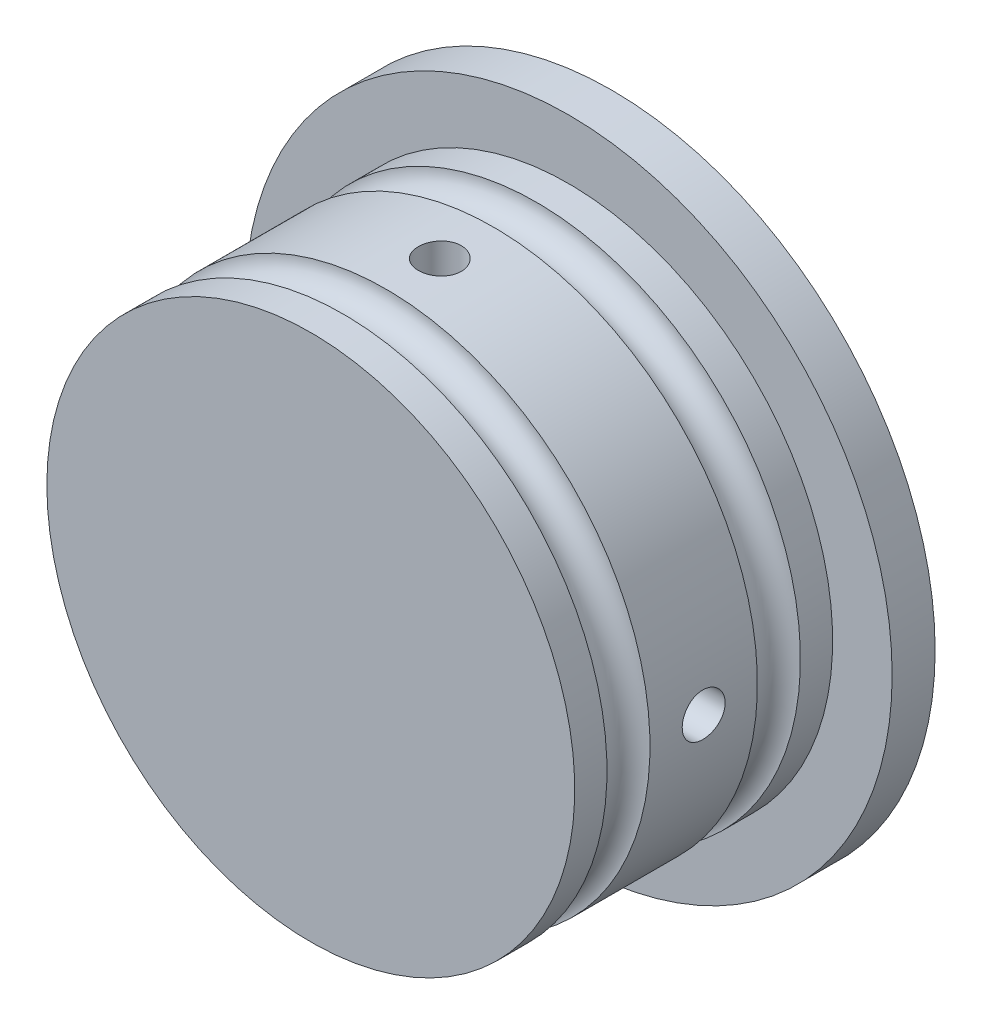
ISO-10303-21;
HEADER;
FILE_DESCRIPTION(('STEP AP214'),'2;1');
FILE_NAME('part.step','',(''),(''),'','','');
FILE_SCHEMA(('AUTOMOTIVE_DESIGN { 1 0 10303 214 1 1 1 1 }'));
ENDSEC;
DATA;
#1=APPLICATION_CONTEXT('core data for automotive mechanical design processes');
#2=APPLICATION_PROTOCOL_DEFINITION('international standard','automotive_design',2000,#1);
#3=PRODUCT_CONTEXT('',#1,'mechanical');
#4=PRODUCT('Part','Part','',(#3));
#5=PRODUCT_RELATED_PRODUCT_CATEGORY('part','',(#4));
#6=PRODUCT_DEFINITION_FORMATION('','',#4);
#7=PRODUCT_DEFINITION_CONTEXT('part definition',#1,'design');
#8=PRODUCT_DEFINITION('design','',#6,#7);
#9=PRODUCT_DEFINITION_SHAPE('','',#8);
#10=(LENGTH_UNIT() NAMED_UNIT(*) SI_UNIT(.MILLI.,.METRE.));
#11=(NAMED_UNIT(*) PLANE_ANGLE_UNIT() SI_UNIT($,.RADIAN.));
#12=(NAMED_UNIT(*) SI_UNIT($,.STERADIAN.) SOLID_ANGLE_UNIT());
#13=UNCERTAINTY_MEASURE_WITH_UNIT(LENGTH_MEASURE(1.E-05),#10,'distance_accuracy_value','');
#14=(GEOMETRIC_REPRESENTATION_CONTEXT(3) GLOBAL_UNCERTAINTY_ASSIGNED_CONTEXT((#13)) GLOBAL_UNIT_ASSIGNED_CONTEXT((#10,
#11,#12)) REPRESENTATION_CONTEXT('',''));
#15=CARTESIAN_POINT('',(0.,0.,0.));
#16=DIRECTION('',(0.,0.,1.));
#17=DIRECTION('',(1.,0.,0.));
#18=AXIS2_PLACEMENT_3D('',#15,#16,#17);
#19=CARTESIAN_POINT('',(0.,0.,-5.));
#20=DIRECTION('',(0.,0.,-1.));
#21=DIRECTION('',(-1.,0.,0.));
#22=AXIS2_PLACEMENT_3D('',#19,#20,#21);
#23=TOROIDAL_SURFACE('',#22,24.5618,2.);
#24=CARTESIAN_POINT('',(0.,0.,-3.));
#25=DIRECTION('',(0.,0.,-1.));
#26=DIRECTION('',(-1.,0.,0.));
#27=AXIS2_PLACEMENT_3D('',#24,#25,#26);
#28=CIRCLE('',#27,24.5618);
#29=CARTESIAN_POINT('',(-24.5618,0.,-2.99999999999999));
#30=VERTEX_POINT('',#29);
#31=EDGE_CURVE('E96',#30,#30,#28,.T.);
#32=ORIENTED_EDGE('',*,*,#31,.T.);
#33=EDGE_LOOP('',(#32));
#34=FACE_BOUND('',#33,.T.);
#35=CARTESIAN_POINT('',(0.,0.,-7.));
#36=DIRECTION('',(0.,0.,-1.));
#37=DIRECTION('',(-1.,0.,0.));
#38=AXIS2_PLACEMENT_3D('',#35,#36,#37);
#39=CIRCLE('',#38,24.5618);
#40=CARTESIAN_POINT('',(-24.5618,0.,-6.99999999999999));
#41=VERTEX_POINT('',#40);
#42=EDGE_CURVE('E117',#41,#41,#39,.T.);
#43=ORIENTED_EDGE('',*,*,#42,.F.);
#44=EDGE_LOOP('',(#43));
#45=FACE_BOUND('',#44,.T.);
#46=ADVANCED_FACE('F42',(#34,#45),#23,.F.);
#47=CARTESIAN_POINT('',(0.,0.,0.));
#48=DIRECTION('',(0.,0.,-1.));
#49=DIRECTION('',(-1.,0.,0.));
#50=AXIS2_PLACEMENT_3D('',#47,#48,#49);
#51=CYLINDRICAL_SURFACE('',#50,24.5618);
#52=CARTESIAN_POINT('',(0.,24.5618,-10.));
#53=CARTESIAN_POINT('',(0.112141593484284,24.5617989315381,-10.0000049020538));
#54=CARTESIAN_POINT('',(0.224359753682783,24.5610238041837,-10.0094635252001));
#55=CARTESIAN_POINT('',(0.445691870877717,24.5580061929669,-10.0470569367844));
#56=CARTESIAN_POINT('',(0.554802154040234,24.5557620420353,-10.0752129438113));
#57=CARTESIAN_POINT('',(0.766680862127183,24.5500600119672,-10.1493820914568));
#58=CARTESIAN_POINT('',(0.869452812845108,24.5466028148983,-10.1953851986019));
#59=CARTESIAN_POINT('',(1.06579142249054,24.5388625155217,-10.3039249052292));
#60=CARTESIAN_POINT('',(1.15936005884671,24.5345795912182,-10.3664579423881));
#61=CARTESIAN_POINT('',(1.33488912846527,24.5256568334725,-10.5064473920805));
#62=CARTESIAN_POINT('',(1.41682401646289,24.5210162481034,-10.583935790034));
#63=CARTESIAN_POINT('',(1.56654063553065,24.5119075106197,-10.7515688819079));
#64=CARTESIAN_POINT('',(1.63432174808071,24.5074393660478,-10.8417141286448));
#65=CARTESIAN_POINT('',(1.75389264893785,24.4991732510784,-11.0322559508388));
#66=CARTESIAN_POINT('',(1.80566007898367,24.495376220829,-11.1326666010781));
#67=CARTESIAN_POINT('',(1.89159128999186,24.4888907359155,-11.3407907972975));
#68=CARTESIAN_POINT('',(1.9257553692466,24.4862022624669,-11.4485042194959));
#69=CARTESIAN_POINT('',(1.97543622928648,24.4822445277376,-11.667921123265));
#70=CARTESIAN_POINT('',(1.99099451343036,24.4809721081524,-11.7796151496522));
#71=CARTESIAN_POINT('',(2.00315034735597,24.4799805359081,-12.0040359862115));
#72=CARTESIAN_POINT('',(1.99974823836818,24.4802613552954,-12.1167627777604));
#73=CARTESIAN_POINT('',(1.97411417310489,24.4823416649179,-12.3397649924564));
#74=CARTESIAN_POINT('',(1.95192730225627,24.4841375188721,-12.4500456368249));
#75=CARTESIAN_POINT('',(1.88942355030134,24.4890398398193,-12.6653124346069));
#76=CARTESIAN_POINT('',(1.84910649915275,24.4921463191047,-12.770298538353));
#77=CARTESIAN_POINT('',(1.75143628711168,24.4993240464498,-12.9721398859642));
#78=CARTESIAN_POINT('',(1.69406287524153,24.503396440169,-13.0689852880698));
#79=CARTESIAN_POINT('',(1.56392316814493,24.5120460643319,-13.2516885237947));
#80=CARTESIAN_POINT('',(1.49115657548137,24.5166233045296,-13.3375461450495));
#81=CARTESIAN_POINT('',(1.33204310256097,24.5257830444989,-13.4960988014769));
#82=CARTESIAN_POINT('',(1.24565724110516,24.5303655206871,-13.5687547246845));
#83=CARTESIAN_POINT('',(1.06189347075869,24.539006664802,-13.6985392186491));
#84=CARTESIAN_POINT('',(0.964515554952616,24.5430653323991,-13.7556677796372));
#85=CARTESIAN_POINT('',(0.761506630039601,24.5502022750297,-13.8527733542804));
#86=CARTESIAN_POINT('',(0.655874801093998,24.5532804525191,-13.8927486615831));
#87=CARTESIAN_POINT('',(0.439368106967173,24.5581084499975,-13.95438572291));
#88=CARTESIAN_POINT('',(0.328493345719897,24.5598582963072,-13.9760478398075));
#89=CARTESIAN_POINT('',(0.104987164488317,24.5618290904762,-14.000394634272));
#90=CARTESIAN_POINT('',(-0.00763833330805738,24.5620543911013,-14.0031333409804));
#91=CARTESIAN_POINT('',(-0.231746894721815,24.5609623288911,-13.9896970727245));
#92=CARTESIAN_POINT('',(-0.343229968497791,24.5596449797852,-13.9735222660893));
#93=CARTESIAN_POINT('',(-0.561735222462762,24.555618584257,-13.922762890987));
#94=CARTESIAN_POINT('',(-0.668763251963103,24.552911429186,-13.8882033395402));
#95=CARTESIAN_POINT('',(-0.875501407128315,24.546409580638,-13.80168103029));
#96=CARTESIAN_POINT('',(-0.975211422140219,24.5426148707207,-13.7497180094012));
#97=CARTESIAN_POINT('',(-1.16472918323041,24.5343525505742,-13.6297278429422));
#98=CARTESIAN_POINT('',(-1.25451418216656,24.5298834479216,-13.5616648738822));
#99=CARTESIAN_POINT('',(-1.42140369104063,24.5207795496764,-13.4114586580116));
#100=CARTESIAN_POINT('',(-1.4985079905833,24.5161447513361,-13.3293151776265));
#101=CARTESIAN_POINT('',(-1.63803248389922,24.5072189736166,-13.1530453765412));
#102=CARTESIAN_POINT('',(-1.70041744148014,24.5029288351646,-13.0588911165342));
#103=CARTESIAN_POINT('',(-1.80849082930023,24.4951899013907,-12.8614116583699));
#104=CARTESIAN_POINT('',(-1.85417941976494,24.491741097995,-12.7580865482319));
#105=CARTESIAN_POINT('',(-1.92750301657035,24.4860799528594,-12.5453235827516));
#106=CARTESIAN_POINT('',(-1.95515965547433,24.4838661300009,-12.4358932235636));
#107=CARTESIAN_POINT('',(-1.99170473324202,24.4809205894274,-12.2139232868119));
#108=CARTESIAN_POINT('',(-2.00059351440141,24.4801888446817,-12.1013837659923));
#109=CARTESIAN_POINT('',(-1.99934667866096,24.4802906813167,-11.8767402768909));
#110=CARTESIAN_POINT('',(-1.98926642818183,24.4811197071555,-11.7646359950823));
#111=CARTESIAN_POINT('',(-1.95048305264909,24.4842399975027,-11.5437181212838));
#112=CARTESIAN_POINT('',(-1.92177989854327,24.4865312642922,-11.4349045344278));
#113=CARTESIAN_POINT('',(-1.84657937422378,24.4923166738982,-11.2236528125319));
#114=CARTESIAN_POINT('',(-1.80008293099243,24.4958107540503,-11.1212143456887));
#115=CARTESIAN_POINT('',(-1.69062199128454,24.5036081825675,-10.9255884943614));
#116=CARTESIAN_POINT('',(-1.62765777053479,24.5079115173825,-10.8324009550211));
#117=CARTESIAN_POINT('',(-1.48684069913071,24.5168574897543,-10.6576390089617));
#118=CARTESIAN_POINT('',(-1.40894691182999,24.5215010380278,-10.5760976343681));
#119=CARTESIAN_POINT('',(-1.24055490572392,24.5305959311298,-10.427214173869));
#120=CARTESIAN_POINT('',(-1.1500536382543,24.5350472291274,-10.3598755323132));
#121=CARTESIAN_POINT('',(-0.958848784812722,24.5432637395329,-10.2412230820901));
#122=CARTESIAN_POINT('',(-0.85812717215382,24.5470277057108,-10.1899382634007));
#123=CARTESIAN_POINT('',(-0.649541116056525,24.55343067707,-10.1050736959999));
#124=CARTESIAN_POINT('',(-0.541685061367792,24.5560709772283,-10.0714735558208));
#125=CARTESIAN_POINT('',(-0.360991871524535,24.5592498609918,-10.0315076050263));
#126=CARTESIAN_POINT('',(-0.289317448558782,24.5602018203546,-10.0197079132138));
#127=CARTESIAN_POINT('',(-0.145106036745537,24.5614772347798,-10.0039525344564));
#128=CARTESIAN_POINT('',(-0.0725690500678832,24.5618006914229,-9.99999682778376));
#129=CARTESIAN_POINT('',(0.,24.5618,-10.));
#130=B_SPLINE_CURVE_WITH_KNOTS('',3,(#52,#53,#54,#55,#56,#57,#58,#59,#60,#61,#62,#63,#64,#65,
#66,#67,#68,#69,#70,#71,#72,#73,#74,#75,#76,#77,#78,#79,#80,#81,#82,#83,#84,#85,#86,#87,#88,#89,
#90,#91,#92,#93,#94,#95,#96,#97,#98,#99,#100,#101,#102,#103,#104,#105,#106,#107,#108,#109,#110,
#111,#112,#113,#114,#115,#116,#117,#118,#119,#120,#121,#122,#123,#124,#125,#126,#127,#128,#129),
.UNSPECIFIED.,.T.,.F.,(4,2,2,2,2,2,2,2,2,2,2,2,2,2,2,2,2,2,2,2,2,2,2,2,2,2,2,2,2,2,2,2,2,2,2,2,
2,2,4),(0.,0.336159827874989,0.672701797698239,1.0090548402966,1.34533545531822,1.6823434160332,
2.01936610091734,2.35685723401653,2.6943426480717,3.03107383142367,3.36779895463901,
3.70371818528233,4.03964056656492,4.37596339151666,4.71229271571158,5.04960277158239,
5.3869130396661,5.72425685455182,6.06159398486005,6.39796756819627,6.73433815785191,
7.07025219804377,7.40617131642045,7.74284502783746,8.07952432470398,8.41700159120253,
8.75447561903853,9.09154403758111,9.42860630848188,9.76468629459758,10.1007668050078,
10.4368298089137,10.7728871863381,11.1098795630184,11.4469535710586,11.7846328017556,
12.1219218108085,12.3394580520542,12.556993746188),.UNSPECIFIED.);
#131=CARTESIAN_POINT('',(0.,24.5618,-10.));
#132=VERTEX_POINT('',#131);
#133=EDGE_CURVE('E11',#132,#132,#130,.T.);
#134=ORIENTED_EDGE('',*,*,#133,.F.);
#135=EDGE_LOOP('',(#134));
#136=FACE_BOUND('',#135,.T.);
#137=CARTESIAN_POINT('',(24.5618,0.,-14.));
#138=CARTESIAN_POINT('',(24.5617989315381,0.112141593484284,-13.9999950979464));
#139=CARTESIAN_POINT('',(24.5610238041837,0.224359753682799,-13.9905364748003));
#140=CARTESIAN_POINT('',(24.5580061929669,0.445691870877797,-13.9529430632164));
#141=CARTESIAN_POINT('',(24.5557620420353,0.554802154040363,-13.9247870561896));
#142=CARTESIAN_POINT('',(24.5500600119672,0.76668086212744,-13.8506179085445));
#143=CARTESIAN_POINT('',(24.5466028148983,0.869452812845445,-13.8046148013996));
#144=CARTESIAN_POINT('',(24.5388625155217,1.06579142249106,-13.6960750947727));
#145=CARTESIAN_POINT('',(24.5345795912182,1.15936005884735,-13.6335420576139));
#146=CARTESIAN_POINT('',(24.5256568334725,1.33488912846614,-13.4935526079218));
#147=CARTESIAN_POINT('',(24.5210162481033,1.4168240164639,-13.4160642099684));
#148=CARTESIAN_POINT('',(24.5119075106196,1.56654063553194,-13.2484311180948));
#149=CARTESIAN_POINT('',(24.5074393660477,1.63432174808216,-13.158285871358));
#150=CARTESIAN_POINT('',(24.4991732510783,1.75389264893964,-12.9677440491642));
#151=CARTESIAN_POINT('',(24.4953762208288,1.80566007898563,-12.8673333989251));
#152=CARTESIAN_POINT('',(24.4888907359153,1.89159128999419,-12.6592092027058));
#153=CARTESIAN_POINT('',(24.4862022624667,1.92575536924912,-12.5514957805075));
#154=CARTESIAN_POINT('',(24.4822445277374,1.97543622928937,-12.3320788767384));
#155=CARTESIAN_POINT('',(24.4809721081522,1.99099451343345,-12.2203848503513));
#156=CARTESIAN_POINT('',(24.4799805359078,2.00315034735945,-11.995964013792));
#157=CARTESIAN_POINT('',(24.4802613552951,1.99974823837185,-11.8832372222431));
#158=CARTESIAN_POINT('',(24.4823416649176,1.97411417310895,-11.660235007547));
#159=CARTESIAN_POINT('',(24.4841375188717,1.95192730226053,-11.5499543631786));
#160=CARTESIAN_POINT('',(24.489039839819,1.88942355030597,-11.3346875653964));
#161=CARTESIAN_POINT('',(24.4921463191043,1.84910649915757,-11.2297014616503));
#162=CARTESIAN_POINT('',(24.4993240464494,1.75143628711684,-11.0278601140389));
#163=CARTESIAN_POINT('',(24.5033964401687,1.69406287524686,-10.9310147119332));
#164=CARTESIAN_POINT('',(24.5120460643315,1.56392316815058,-10.748311476208));
#165=CARTESIAN_POINT('',(24.5166233045293,1.49115657548718,-10.6624538549531));
#166=CARTESIAN_POINT('',(24.5257830444986,1.33204310256706,-10.5039011985255));
#167=CARTESIAN_POINT('',(24.5303655206868,1.24565724111137,-10.4312452753176));
#168=CARTESIAN_POINT('',(24.5390066648017,1.06189347076513,-10.3014607813527));
#169=CARTESIAN_POINT('',(24.5430653323989,0.964515554959161,-10.2443322203645));
#170=CARTESIAN_POINT('',(24.5502022750294,0.761506630046316,-10.147226645721));
#171=CARTESIAN_POINT('',(24.5532804525189,0.655874801100781,-10.107251338418));
#172=CARTESIAN_POINT('',(24.5581084499974,0.43936810697406,-10.0456142770908));
#173=CARTESIAN_POINT('',(24.5598582963071,0.32849334572682,-10.0239521601931));
#174=CARTESIAN_POINT('',(24.5618290904761,0.104987164495279,-9.99960536572818));
#175=CARTESIAN_POINT('',(24.5620543911013,-0.00763833330109409,-9.99686665901955));
#176=CARTESIAN_POINT('',(24.5609623288912,-0.231746894714881,-10.0103029272751));
#177=CARTESIAN_POINT('',(24.5596449797853,-0.343229968490887,-10.0264777339101));
#178=CARTESIAN_POINT('',(24.5556185842572,-0.56173522245595,-10.0772371090121));
#179=CARTESIAN_POINT('',(24.5529114291862,-0.668763251956351,-10.1117966604586));
#180=CARTESIAN_POINT('',(24.5464095806382,-0.875501407121713,-10.1983189697085));
#181=CARTESIAN_POINT('',(24.5426148707209,-0.975211422133708,-10.2502819905971));
#182=CARTESIAN_POINT('',(24.5343525505745,-1.16472918322411,-10.3702721570558));
#183=CARTESIAN_POINT('',(24.5298834479219,-1.25451418216037,-10.4383351261156));
#184=CARTESIAN_POINT('',(24.5207795496767,-1.4214036910347,-10.588541341986));
#185=CARTESIAN_POINT('',(24.5161447513364,-1.49850799057751,-10.6706848223709));
#186=CARTESIAN_POINT('',(24.5072189736169,-1.63803248389374,-10.8469546234559));
#187=CARTESIAN_POINT('',(24.502928835165,-1.70041744147482,-10.9411088834628));
#188=CARTESIAN_POINT('',(24.4951899013911,-1.80849082929525,-11.1385883416269));
#189=CARTESIAN_POINT('',(24.4917410979953,-1.85417941976015,-11.2419134517649));
#190=CARTESIAN_POINT('',(24.4860799528597,-1.92750301656592,-11.454676417245));
#191=CARTESIAN_POINT('',(24.4838661300012,-1.9551596554701,-11.564106776433));
#192=CARTESIAN_POINT('',(24.4809205894277,-1.99170473323817,-11.7860767131846));
#193=CARTESIAN_POINT('',(24.480188844682,-2.00059351439776,-11.8986162340042));
#194=CARTESIAN_POINT('',(24.480290681317,-1.9993466786577,-12.1232597231057));
#195=CARTESIAN_POINT('',(24.4811197071557,-1.98926642817877,-12.2353640049143));
#196=CARTESIAN_POINT('',(24.4842399975029,-1.95048305264641,-12.4562818787128));
#197=CARTESIAN_POINT('',(24.4865312642924,-1.92177989854078,-12.5650954655689));
#198=CARTESIAN_POINT('',(24.4923166738984,-1.84657937422165,-12.7763471874649));
#199=CARTESIAN_POINT('',(24.4958107540505,-1.80008293099048,-12.8787856543082));
#200=CARTESIAN_POINT('',(24.5036081825676,-1.69062199128293,-13.0744115056357));
#201=CARTESIAN_POINT('',(24.5079115173826,-1.62765777053335,-13.1675990449761));
#202=CARTESIAN_POINT('',(24.5168574897544,-1.48684069912956,-13.3423609910357));
#203=CARTESIAN_POINT('',(24.5215010380278,-1.40894691182899,-13.4239023656294));
#204=CARTESIAN_POINT('',(24.5305959311298,-1.24055490572318,-13.5727858261289));
#205=CARTESIAN_POINT('',(24.5350472291275,-1.15005363825368,-13.6401244676848));
#206=CARTESIAN_POINT('',(24.5432637395329,-0.958848784812309,-13.7587769179082));
#207=CARTESIAN_POINT('',(24.5470277057108,-0.858127172153497,-13.8100617365978));
#208=CARTESIAN_POINT('',(24.55343067707,-0.649541116056351,-13.8949263039989));
#209=CARTESIAN_POINT('',(24.5560709772283,-0.541685061367677,-13.9285264441783));
#210=CARTESIAN_POINT('',(24.5592498609918,-0.360991871524488,-13.9684923949731));
#211=CARTESIAN_POINT('',(24.5602018203546,-0.289317448558754,-13.9802920867857));
#212=CARTESIAN_POINT('',(24.5614772347798,-0.145106036745533,-13.9960474655433));
#213=CARTESIAN_POINT('',(24.5618006914229,-0.0725690500678837,-14.0000031722161));
#214=CARTESIAN_POINT('',(24.5618,0.,-14.));
#215=B_SPLINE_CURVE_WITH_KNOTS('',3,(#137,#138,#139,#140,#141,#142,#143,#144,#145,#146,#147,
#148,#149,#150,#151,#152,#153,#154,#155,#156,#157,#158,#159,#160,#161,#162,#163,#164,#165,#166,
#167,#168,#169,#170,#171,#172,#173,#174,#175,#176,#177,#178,#179,#180,#181,#182,#183,#184,#185,
#186,#187,#188,#189,#190,#191,#192,#193,#194,#195,#196,#197,#198,#199,#200,#201,#202,#203,#204,
#205,#206,#207,#208,#209,#210,#211,#212,#213,#214),.UNSPECIFIED.,.T.,.F.,(4,2,2,2,2,2,2,2,2,2,2,
2,2,2,2,2,2,2,2,2,2,2,2,2,2,2,2,2,2,2,2,2,2,2,2,2,2,2,4),(0.,0.336159827874986,
0.672701797698235,1.0090548402966,1.34533545531821,1.68234341603319,2.01936610091733,
2.35685723401653,2.69434264807169,3.03107383142367,3.36779895463901,3.70371818528233,
4.03964056656492,4.37596339151665,4.71229271571156,5.04960277158238,5.38691303966608,
5.7242568545518,6.06159398486005,6.39796756819628,6.73433815785193,7.07025219804378,
7.40617131642046,7.74284502783746,8.07952432470397,8.41700159120252,8.75447561903851,
9.09154403758109,9.42860630848187,9.76468629459758,10.1007668050078,10.4368298089137,
10.7728871863381,11.1098795630184,11.4469535710586,11.7846328017556,12.1219218108085,
12.3394580520542,12.556993746188),.UNSPECIFIED.);
#216=CARTESIAN_POINT('',(24.5618,0.,-14.));
#217=VERTEX_POINT('',#216);
#218=EDGE_CURVE('E53',#217,#217,#215,.T.);
#219=ORIENTED_EDGE('',*,*,#218,.F.);
#220=EDGE_LOOP('',(#219));
#221=FACE_BOUND('',#220,.T.);
#222=CARTESIAN_POINT('',(0.,-24.5618,-14.));
#223=CARTESIAN_POINT('',(0.112141593484283,-24.5617989315381,-13.9999950979462));
#224=CARTESIAN_POINT('',(0.224359753682782,-24.5610238041837,-13.9905364747999));
#225=CARTESIAN_POINT('',(0.445691870877716,-24.5580061929669,-13.9529430632156));
#226=CARTESIAN_POINT('',(0.554802154040234,-24.5557620420353,-13.9247870561887));
#227=CARTESIAN_POINT('',(0.766680862127183,-24.5500600119672,-13.8506179085432));
#228=CARTESIAN_POINT('',(0.869452812845108,-24.5466028148983,-13.8046148013981));
#229=CARTESIAN_POINT('',(1.06579142249054,-24.5388625155217,-13.6960750947708));
#230=CARTESIAN_POINT('',(1.15936005884671,-24.5345795912182,-13.6335420576119));
#231=CARTESIAN_POINT('',(1.33488912846526,-24.5256568334725,-13.4935526079195));
#232=CARTESIAN_POINT('',(1.41682401646289,-24.5210162481034,-13.416064209966));
#233=CARTESIAN_POINT('',(1.56654063553064,-24.5119075106197,-13.2484311180921));
#234=CARTESIAN_POINT('',(1.63432174808071,-24.5074393660478,-13.1582858713552));
#235=CARTESIAN_POINT('',(1.75389264893785,-24.4991732510784,-12.9677440491612));
#236=CARTESIAN_POINT('',(1.80566007898367,-24.495376220829,-12.867333398922));
#237=CARTESIAN_POINT('',(1.89159128999186,-24.4888907359155,-12.6592092027025));
#238=CARTESIAN_POINT('',(1.9257553692466,-24.4862022624669,-12.5514957805042));
#239=CARTESIAN_POINT('',(1.97543622928648,-24.4822445277376,-12.332078876735));
#240=CARTESIAN_POINT('',(1.99099451343036,-24.4809721081524,-12.2203848503478));
#241=CARTESIAN_POINT('',(2.00315034735597,-24.4799805359081,-11.9959640137886));
#242=CARTESIAN_POINT('',(1.99974823836818,-24.4802613552954,-11.8832372222397));
#243=CARTESIAN_POINT('',(1.97411417310489,-24.4823416649179,-11.6602350075436));
#244=CARTESIAN_POINT('',(1.95192730225627,-24.4841375188721,-11.5499543631752));
#245=CARTESIAN_POINT('',(1.88942355030134,-24.4890398398193,-11.3346875653931));
#246=CARTESIAN_POINT('',(1.84910649915275,-24.4921463191047,-11.229701461647));
#247=CARTESIAN_POINT('',(1.75143628711168,-24.4993240464498,-11.0278601140358));
#248=CARTESIAN_POINT('',(1.69406287524153,-24.503396440169,-10.9310147119302));
#249=CARTESIAN_POINT('',(1.56392316814493,-24.5120460643319,-10.7483114762053));
#250=CARTESIAN_POINT('',(1.49115657548137,-24.5166233045296,-10.6624538549505));
#251=CARTESIAN_POINT('',(1.33204310256097,-24.5257830444989,-10.5039011985231));
#252=CARTESIAN_POINT('',(1.24565724110516,-24.5303655206871,-10.4312452753155));
#253=CARTESIAN_POINT('',(1.06189347075869,-24.539006664802,-10.3014607813509));
#254=CARTESIAN_POINT('',(0.964515554952616,-24.5430653323991,-10.2443322203628));
#255=CARTESIAN_POINT('',(0.761506630039601,-24.5502022750297,-10.1472266457196));
#256=CARTESIAN_POINT('',(0.655874801093998,-24.5532804525191,-10.1072513384169));
#257=CARTESIAN_POINT('',(0.439368106967173,-24.5581084499975,-10.04561427709));
#258=CARTESIAN_POINT('',(0.328493345719897,-24.5598582963072,-10.0239521601925));
#259=CARTESIAN_POINT('',(0.104987164488317,-24.5618290904762,-9.99960536572799));
#260=CARTESIAN_POINT('',(-0.00763833330805781,-24.5620543911013,-9.99686665901957));
#261=CARTESIAN_POINT('',(-0.231746894721816,-24.5609623288911,-10.0103029272755));
#262=CARTESIAN_POINT('',(-0.343229968497791,-24.5596449797852,-10.0264777339107));
#263=CARTESIAN_POINT('',(-0.561735222462762,-24.555618584257,-10.077237109013));
#264=CARTESIAN_POINT('',(-0.668763251963103,-24.552911429186,-10.1117966604598));
#265=CARTESIAN_POINT('',(-0.875501407128315,-24.546409580638,-10.19831896971));
#266=CARTESIAN_POINT('',(-0.97521142214022,-24.5426148707207,-10.2502819905988));
#267=CARTESIAN_POINT('',(-1.16472918323041,-24.5343525505742,-10.3702721570578));
#268=CARTESIAN_POINT('',(-1.25451418216656,-24.5298834479216,-10.4383351261178));
#269=CARTESIAN_POINT('',(-1.42140369104063,-24.5207795496764,-10.5885413419885));
#270=CARTESIAN_POINT('',(-1.4985079905833,-24.5161447513361,-10.6706848223735));
#271=CARTESIAN_POINT('',(-1.63803248389922,-24.5072189736166,-10.8469546234588));
#272=CARTESIAN_POINT('',(-1.70041744148014,-24.5029288351646,-10.9411088834658));
#273=CARTESIAN_POINT('',(-1.80849082930022,-24.4951899013907,-11.1385883416301));
#274=CARTESIAN_POINT('',(-1.85417941976494,-24.491741097995,-11.2419134517681));
#275=CARTESIAN_POINT('',(-1.92750301657035,-24.4860799528594,-11.4546764172484));
#276=CARTESIAN_POINT('',(-1.95515965547433,-24.4838661300009,-11.5641067764364));
#277=CARTESIAN_POINT('',(-1.99170473324202,-24.4809205894274,-11.7860767131881));
#278=CARTESIAN_POINT('',(-2.00059351440141,-24.4801888446817,-11.8986162340077));
#279=CARTESIAN_POINT('',(-1.99934667866096,-24.4802906813167,-12.1232597231092));
#280=CARTESIAN_POINT('',(-1.98926642818183,-24.4811197071555,-12.2353640049177));
#281=CARTESIAN_POINT('',(-1.95048305264909,-24.4842399975027,-12.4562818787162));
#282=CARTESIAN_POINT('',(-1.92177989854327,-24.4865312642922,-12.5650954655723));
#283=CARTESIAN_POINT('',(-1.84657937422378,-24.4923166738982,-12.7763471874681));
#284=CARTESIAN_POINT('',(-1.80008293099243,-24.4958107540503,-12.8787856543113));
#285=CARTESIAN_POINT('',(-1.69062199128454,-24.5036081825675,-13.0744115056387));
#286=CARTESIAN_POINT('',(-1.62765777053479,-24.5079115173825,-13.1675990449789));
#287=CARTESIAN_POINT('',(-1.4868406991307,-24.5168574897543,-13.3423609910383));
#288=CARTESIAN_POINT('',(-1.40894691182999,-24.5215010380278,-13.4239023656319));
#289=CARTESIAN_POINT('',(-1.24055490572392,-24.5305959311298,-13.572785826131));
#290=CARTESIAN_POINT('',(-1.1500536382543,-24.5350472291274,-13.6401244676868));
#291=CARTESIAN_POINT('',(-0.958848784812722,-24.5432637395329,-13.7587769179099));
#292=CARTESIAN_POINT('',(-0.85812717215382,-24.5470277057108,-13.8100617365993));
#293=CARTESIAN_POINT('',(-0.649541116056525,-24.55343067707,-13.8949263040001));
#294=CARTESIAN_POINT('',(-0.541685061367792,-24.5560709772283,-13.9285264441792));
#295=CARTESIAN_POINT('',(-0.360991871524534,-24.5592498609918,-13.9684923949737));
#296=CARTESIAN_POINT('',(-0.289317448558782,-24.5602018203546,-13.9802920867862));
#297=CARTESIAN_POINT('',(-0.145106036745537,-24.5614772347798,-13.9960474655436));
#298=CARTESIAN_POINT('',(-0.0725690500678834,-24.5618006914229,-14.0000031722163));
#299=CARTESIAN_POINT('',(0.,-24.5618,-14.));
#300=B_SPLINE_CURVE_WITH_KNOTS('',3,(#222,#223,#224,#225,#226,#227,#228,#229,#230,#231,#232,
#233,#234,#235,#236,#237,#238,#239,#240,#241,#242,#243,#244,#245,#246,#247,#248,#249,#250,#251,
#252,#253,#254,#255,#256,#257,#258,#259,#260,#261,#262,#263,#264,#265,#266,#267,#268,#269,#270,
#271,#272,#273,#274,#275,#276,#277,#278,#279,#280,#281,#282,#283,#284,#285,#286,#287,#288,#289,
#290,#291,#292,#293,#294,#295,#296,#297,#298,#299),.UNSPECIFIED.,.T.,.F.,(4,2,2,2,2,2,2,2,2,2,2,
2,2,2,2,2,2,2,2,2,2,2,2,2,2,2,2,2,2,2,2,2,2,2,2,2,2,2,4),(0.,0.336159827874988,
0.672701797698239,1.0090548402966,1.34533545531822,1.68234341603319,2.01936610091734,
2.35685723401653,2.6943426480717,3.03107383142367,3.36779895463901,3.70371818528233,
4.03964056656492,4.37596339151666,4.71229271571158,5.04960277158239,5.3869130396661,
5.72425685455182,6.06159398486005,6.39796756819627,6.73433815785191,7.07025219804377,
7.40617131642045,7.74284502783746,8.07952432470398,8.41700159120253,8.75447561903853,
9.09154403758111,9.42860630848188,9.76468629459759,10.1007668050078,10.4368298089137,
10.7728871863381,11.1098795630184,11.4469535710586,11.7846328017556,12.1219218108085,
12.3394580520542,12.556993746188),.UNSPECIFIED.);
#301=CARTESIAN_POINT('',(0.,-24.5618,-14.));
#302=VERTEX_POINT('',#301);
#303=EDGE_CURVE('E127',#302,#302,#300,.T.);
#304=ORIENTED_EDGE('',*,*,#303,.F.);
#305=EDGE_LOOP('',(#304));
#306=FACE_BOUND('',#305,.T.);
#307=CARTESIAN_POINT('',(-24.5618,0.,-10.));
#308=CARTESIAN_POINT('',(-24.5617989315381,0.112141593484285,-10.0000049020536));
#309=CARTESIAN_POINT('',(-24.5610238041837,0.2243597536828,-10.0094635251997));
#310=CARTESIAN_POINT('',(-24.5580061929669,0.445691870877797,-10.0470569367836));
#311=CARTESIAN_POINT('',(-24.5557620420353,0.554802154040363,-10.0752129438104));
#312=CARTESIAN_POINT('',(-24.5500600119672,0.766680862127439,-10.1493820914555));
#313=CARTESIAN_POINT('',(-24.5466028148983,0.869452812845444,-10.1953851986004));
#314=CARTESIAN_POINT('',(-24.5388625155217,1.06579142249106,-10.3039249052273));
#315=CARTESIAN_POINT('',(-24.5345795912182,1.15936005884735,-10.3664579423861));
#316=CARTESIAN_POINT('',(-24.5256568334725,1.33488912846614,-10.5064473920782));
#317=CARTESIAN_POINT('',(-24.5210162481033,1.4168240164639,-10.5839357900316));
#318=CARTESIAN_POINT('',(-24.5119075106196,1.56654063553194,-10.7515688819052));
#319=CARTESIAN_POINT('',(-24.5074393660477,1.63432174808216,-10.841714128642));
#320=CARTESIAN_POINT('',(-24.4991732510783,1.75389264893964,-11.0322559508358));
#321=CARTESIAN_POINT('',(-24.4953762208288,1.80566007898563,-11.1326666010749));
#322=CARTESIAN_POINT('',(-24.4888907359153,1.89159128999419,-11.3407907972942));
#323=CARTESIAN_POINT('',(-24.4862022624667,1.92575536924911,-11.4485042194925));
#324=CARTESIAN_POINT('',(-24.4822445277374,1.97543622928937,-11.6679211232616));
#325=CARTESIAN_POINT('',(-24.4809721081522,1.99099451343345,-11.7796151496488));
#326=CARTESIAN_POINT('',(-24.4799805359078,2.00315034735945,-12.004035986208));
#327=CARTESIAN_POINT('',(-24.4802613552951,1.99974823837185,-12.1167627777569));
#328=CARTESIAN_POINT('',(-24.4823416649176,1.97411417310895,-12.339764992453));
#329=CARTESIAN_POINT('',(-24.4841375188717,1.95192730226052,-12.4500456368215));
#330=CARTESIAN_POINT('',(-24.489039839819,1.88942355030596,-12.6653124346036));
#331=CARTESIAN_POINT('',(-24.4921463191043,1.84910649915756,-12.7702985383498));
#332=CARTESIAN_POINT('',(-24.4993240464494,1.75143628711684,-12.9721398859611));
#333=CARTESIAN_POINT('',(-24.5033964401687,1.69406287524686,-13.0689852880669));
#334=CARTESIAN_POINT('',(-24.5120460643315,1.56392316815058,-13.251688523792));
#335=CARTESIAN_POINT('',(-24.5166233045293,1.49115657548717,-13.3375461450469));
#336=CARTESIAN_POINT('',(-24.5257830444986,1.33204310256705,-13.4960988014746));
#337=CARTESIAN_POINT('',(-24.5303655206868,1.24565724111136,-13.5687547246824));
#338=CARTESIAN_POINT('',(-24.5390066648017,1.06189347076513,-13.6985392186473));
#339=CARTESIAN_POINT('',(-24.5430653323989,0.964515554959156,-13.7556677796355));
#340=CARTESIAN_POINT('',(-24.5502022750294,0.761506630046311,-13.8527733542791));
#341=CARTESIAN_POINT('',(-24.5532804525189,0.655874801100776,-13.892748661582));
#342=CARTESIAN_POINT('',(-24.5581084499974,0.439368106974056,-13.9543857229092));
#343=CARTESIAN_POINT('',(-24.5598582963071,0.328493345726816,-13.9760478398069));
#344=CARTESIAN_POINT('',(-24.5618290904761,0.104987164495275,-14.0003946342718));
#345=CARTESIAN_POINT('',(-24.5620543911013,-0.00763833330109802,-14.0031333409805));
#346=CARTESIAN_POINT('',(-24.5609623288912,-0.231746894714884,-13.9896970727249));
#347=CARTESIAN_POINT('',(-24.5596449797853,-0.343229968490891,-13.9735222660899));
#348=CARTESIAN_POINT('',(-24.5556185842572,-0.561735222455953,-13.9227628909879));
#349=CARTESIAN_POINT('',(-24.5529114291862,-0.668763251956354,-13.8882033395414));
#350=CARTESIAN_POINT('',(-24.5464095806382,-0.875501407121717,-13.8016810302915));
#351=CARTESIAN_POINT('',(-24.5426148707209,-0.975211422133712,-13.7497180094029));
#352=CARTESIAN_POINT('',(-24.5343525505745,-1.16472918322411,-13.6297278429442));
#353=CARTESIAN_POINT('',(-24.5298834479219,-1.25451418216037,-13.5616648738844));
#354=CARTESIAN_POINT('',(-24.5207795496767,-1.4214036910347,-13.411458658014));
#355=CARTESIAN_POINT('',(-24.5161447513364,-1.49850799057751,-13.3293151776291));
#356=CARTESIAN_POINT('',(-24.5072189736169,-1.63803248389374,-13.1530453765441));
#357=CARTESIAN_POINT('',(-24.502928835165,-1.70041744147482,-13.0588911165372));
#358=CARTESIAN_POINT('',(-24.4951899013911,-1.80849082929525,-12.8614116583731));
#359=CARTESIAN_POINT('',(-24.4917410979953,-1.85417941976015,-12.7580865482351));
#360=CARTESIAN_POINT('',(-24.4860799528597,-1.92750301656592,-12.545323582755));
#361=CARTESIAN_POINT('',(-24.4838661300012,-1.9551596554701,-12.435893223567));
#362=CARTESIAN_POINT('',(-24.4809205894277,-1.99170473323817,-12.2139232868154));
#363=CARTESIAN_POINT('',(-24.480188844682,-2.00059351439776,-12.1013837659958));
#364=CARTESIAN_POINT('',(-24.480290681317,-1.9993466786577,-11.8767402768943));
#365=CARTESIAN_POINT('',(-24.4811197071557,-1.98926642817877,-11.7646359950857));
#366=CARTESIAN_POINT('',(-24.4842399975029,-1.95048305264641,-11.5437181212872));
#367=CARTESIAN_POINT('',(-24.4865312642924,-1.92177989854078,-11.4349045344311));
#368=CARTESIAN_POINT('',(-24.4923166738984,-1.84657937422165,-11.2236528125351));
#369=CARTESIAN_POINT('',(-24.4958107540505,-1.80008293099049,-11.1212143456918));
#370=CARTESIAN_POINT('',(-24.5036081825676,-1.69062199128293,-10.9255884943643));
#371=CARTESIAN_POINT('',(-24.5079115173826,-1.62765777053335,-10.8324009550239));
#372=CARTESIAN_POINT('',(-24.5168574897544,-1.48684069912956,-10.6576390089643));
#373=CARTESIAN_POINT('',(-24.5215010380278,-1.40894691182899,-10.5760976343706));
#374=CARTESIAN_POINT('',(-24.5305959311298,-1.24055490572318,-10.4272141738711));
#375=CARTESIAN_POINT('',(-24.5350472291275,-1.15005363825368,-10.3598755323152));
#376=CARTESIAN_POINT('',(-24.5432637395329,-0.958848784812308,-10.2412230820918));
#377=CARTESIAN_POINT('',(-24.5470277057108,-0.858127172153495,-10.1899382634022));
#378=CARTESIAN_POINT('',(-24.55343067707,-0.649541116056349,-10.1050736960011));
#379=CARTESIAN_POINT('',(-24.5560709772283,-0.541685061367676,-10.0714735558217));
#380=CARTESIAN_POINT('',(-24.5592498609918,-0.360991871524487,-10.031507605027));
#381=CARTESIAN_POINT('',(-24.5602018203546,-0.289317448558754,-10.0197079132143));
#382=CARTESIAN_POINT('',(-24.5614772347798,-0.145106036745532,-10.0039525344567));
#383=CARTESIAN_POINT('',(-24.5618006914229,-0.0725690500678835,-9.99999682778389));
#384=CARTESIAN_POINT('',(-24.5618,0.,-10.));
#385=B_SPLINE_CURVE_WITH_KNOTS('',3,(#307,#308,#309,#310,#311,#312,#313,#314,#315,#316,#317,
#318,#319,#320,#321,#322,#323,#324,#325,#326,#327,#328,#329,#330,#331,#332,#333,#334,#335,#336,
#337,#338,#339,#340,#341,#342,#343,#344,#345,#346,#347,#348,#349,#350,#351,#352,#353,#354,#355,
#356,#357,#358,#359,#360,#361,#362,#363,#364,#365,#366,#367,#368,#369,#370,#371,#372,#373,#374,
#375,#376,#377,#378,#379,#380,#381,#382,#383,#384),.UNSPECIFIED.,.T.,.F.,(4,2,2,2,2,2,2,2,2,2,2,
2,2,2,2,2,2,2,2,2,2,2,2,2,2,2,2,2,2,2,2,2,2,2,2,2,2,2,4),(0.,0.336159827874987,
0.672701797698236,1.0090548402966,1.34533545531821,1.68234341603319,2.01936610091733,
2.35685723401653,2.69434264807169,3.03107383142367,3.36779895463901,3.70371818528233,
4.03964056656492,4.37596339151666,4.71229271571157,5.04960277158238,5.38691303966608,
5.72425685455181,6.06159398486005,6.39796756819628,6.73433815785193,7.07025219804378,
7.40617131642046,7.74284502783746,8.07952432470397,8.41700159120252,8.75447561903851,
9.09154403758109,9.42860630848187,9.76468629459759,10.1007668050078,10.4368298089137,
10.7728871863381,11.1098795630184,11.4469535710586,11.7846328017556,12.1219218108085,
12.3394580520542,12.556993746188),.UNSPECIFIED.);
#386=CARTESIAN_POINT('',(-24.5618,0.,-10.));
#387=VERTEX_POINT('',#386);
#388=EDGE_CURVE('E120',#387,#387,#385,.T.);
#389=ORIENTED_EDGE('',*,*,#388,.F.);
#390=EDGE_LOOP('',(#389));
#391=FACE_BOUND('',#390,.T.);
#392=ORIENTED_EDGE('',*,*,#42,.T.);
#393=EDGE_LOOP('',(#392));
#394=FACE_BOUND('',#393,.T.);
#395=CARTESIAN_POINT('',(0.,0.,-17.));
#396=DIRECTION('',(0.,0.,-1.));
#397=DIRECTION('',(-1.,0.,0.));
#398=AXIS2_PLACEMENT_3D('',#395,#396,#397);
#399=CIRCLE('',#398,24.5618);
#400=CARTESIAN_POINT('',(-24.5618,0.,-17.));
#401=VERTEX_POINT('',#400);
#402=EDGE_CURVE('E114',#401,#401,#399,.T.);
#403=ORIENTED_EDGE('',*,*,#402,.F.);
#404=EDGE_LOOP('',(#403));
#405=FACE_BOUND('',#404,.T.);
#406=ADVANCED_FACE('F132',(#136,#221,#306,#391,#394,#405),#51,.T.);
#407=CARTESIAN_POINT('',(0.,0.,-19.));
#408=DIRECTION('',(0.,0.,-1.));
#409=DIRECTION('',(-1.,0.,0.));
#410=AXIS2_PLACEMENT_3D('',#407,#408,#409);
#411=TOROIDAL_SURFACE('',#410,24.5618,2.);
#412=ORIENTED_EDGE('',*,*,#402,.T.);
#413=EDGE_LOOP('',(#412));
#414=FACE_BOUND('',#413,.T.);
#415=CARTESIAN_POINT('',(0.,0.,-21.));
#416=DIRECTION('',(0.,0.,-1.));
#417=DIRECTION('',(-1.,0.,0.));
#418=AXIS2_PLACEMENT_3D('',#415,#416,#417);
#419=CIRCLE('',#418,24.5618);
#420=CARTESIAN_POINT('',(-24.5618,0.,-21.));
#421=VERTEX_POINT('',#420);
#422=EDGE_CURVE('E111',#421,#421,#419,.T.);
#423=ORIENTED_EDGE('',*,*,#422,.F.);
#424=EDGE_LOOP('',(#423));
#425=FACE_BOUND('',#424,.T.);
#426=ADVANCED_FACE('F167',(#414,#425),#411,.F.);
#427=CARTESIAN_POINT('',(0.,0.,0.));
#428=DIRECTION('',(0.,0.,-1.));
#429=DIRECTION('',(-1.,0.,0.));
#430=AXIS2_PLACEMENT_3D('',#427,#428,#429);
#431=CYLINDRICAL_SURFACE('',#430,24.5618);
#432=ORIENTED_EDGE('',*,*,#422,.T.);
#433=EDGE_LOOP('',(#432));
#434=FACE_BOUND('',#433,.T.);
#435=CARTESIAN_POINT('',(0.,0.,-24.));
#436=DIRECTION('',(0.,0.,-1.));
#437=DIRECTION('',(-1.,0.,0.));
#438=AXIS2_PLACEMENT_3D('',#435,#436,#437);
#439=CIRCLE('',#438,24.5618);
#440=CARTESIAN_POINT('',(-24.5618,0.,-24.));
#441=VERTEX_POINT('',#440);
#442=EDGE_CURVE('E108',#441,#441,#439,.T.);
#443=ORIENTED_EDGE('',*,*,#442,.F.);
#444=EDGE_LOOP('',(#443));
#445=FACE_BOUND('',#444,.T.);
#446=ADVANCED_FACE('F164',(#434,#445),#431,.T.);
#447=CARTESIAN_POINT('',(0.,0.,-24.));
#448=DIRECTION('',(0.,0.,1.));
#449=DIRECTION('',(1.,0.,0.));
#450=AXIS2_PLACEMENT_3D('',#447,#448,#449);
#451=PLANE('',#450);
#452=ORIENTED_EDGE('',*,*,#442,.T.);
#453=EDGE_LOOP('',(#452));
#454=FACE_BOUND('',#453,.T.);
#455=CARTESIAN_POINT('',(0.,0.,-24.));
#456=DIRECTION('',(0.,0.,-1.));
#457=DIRECTION('',(-1.,0.,0.));
#458=AXIS2_PLACEMENT_3D('',#455,#456,#457);
#459=CIRCLE('',#458,30.099);
#460=CARTESIAN_POINT('',(-30.099,0.,-24.));
#461=VERTEX_POINT('',#460);
#462=EDGE_CURVE('E105',#461,#461,#459,.T.);
#463=ORIENTED_EDGE('',*,*,#462,.F.);
#464=EDGE_LOOP('',(#463));
#465=FACE_BOUND('',#464,.T.);
#466=ADVANCED_FACE('F160',(#454,#465),#451,.T.);
#467=CARTESIAN_POINT('',(0.,0.,0.));
#468=DIRECTION('',(0.,0.,-1.));
#469=DIRECTION('',(-1.,0.,0.));
#470=AXIS2_PLACEMENT_3D('',#467,#468,#469);
#471=CYLINDRICAL_SURFACE('',#470,30.099);
#472=CARTESIAN_POINT('',(0.,0.,-28.));
#473=DIRECTION('',(0.,0.,-1.));
#474=DIRECTION('',(-1.,0.,0.));
#475=AXIS2_PLACEMENT_3D('',#472,#473,#474);
#476=CIRCLE('',#475,30.099);
#477=CARTESIAN_POINT('',(-30.099,0.,-28.));
#478=VERTEX_POINT('',#477);
#479=EDGE_CURVE('E102',#478,#478,#476,.T.);
#480=ORIENTED_EDGE('',*,*,#479,.F.);
#481=EDGE_LOOP('',(#480));
#482=FACE_BOUND('',#481,.T.);
#483=ORIENTED_EDGE('',*,*,#462,.T.);
#484=EDGE_LOOP('',(#483));
#485=FACE_BOUND('',#484,.T.);
#486=ADVANCED_FACE('F156',(#482,#485),#471,.T.);
#487=CARTESIAN_POINT('',(0.,0.,-28.));
#488=DIRECTION('',(0.,0.,-1.));
#489=DIRECTION('',(-1.,0.,0.));
#490=AXIS2_PLACEMENT_3D('',#487,#488,#489);
#491=PLANE('',#490);
#492=CARTESIAN_POINT('',(0.,0.,-28.));
#493=DIRECTION('',(0.,0.,-1.));
#494=DIRECTION('',(-1.,0.,0.));
#495=AXIS2_PLACEMENT_3D('',#492,#493,#494);
#496=CIRCLE('',#495,3.);
#497=CARTESIAN_POINT('',(-3.,0.,-28.));
#498=VERTEX_POINT('',#497);
#499=EDGE_CURVE('E80',#498,#498,#496,.T.);
#500=ORIENTED_EDGE('',*,*,#499,.F.);
#501=EDGE_LOOP('',(#500));
#502=FACE_BOUND('',#501,.T.);
#503=ORIENTED_EDGE('',*,*,#479,.T.);
#504=EDGE_LOOP('',(#503));
#505=FACE_BOUND('',#504,.T.);
#506=ADVANCED_FACE('F152',(#502,#505),#491,.T.);
#507=CARTESIAN_POINT('',(0.,0.,0.));
#508=DIRECTION('',(0.,0.,-1.));
#509=DIRECTION('',(-1.,0.,0.));
#510=AXIS2_PLACEMENT_3D('',#507,#508,#509);
#511=PLANE('',#510);
#512=CARTESIAN_POINT('',(0.,0.,0.));
#513=DIRECTION('',(0.,0.,-1.));
#514=DIRECTION('',(-1.,0.,0.));
#515=AXIS2_PLACEMENT_3D('',#512,#513,#514);
#516=CIRCLE('',#515,24.5618);
#517=CARTESIAN_POINT('',(-24.5618,0.,0.));
#518=VERTEX_POINT('',#517);
#519=EDGE_CURVE('E99',#518,#518,#516,.T.);
#520=ORIENTED_EDGE('',*,*,#519,.F.);
#521=EDGE_LOOP('',(#520));
#522=FACE_BOUND('',#521,.T.);
#523=ADVANCED_FACE('F148',(#522),#511,.F.);
#524=CARTESIAN_POINT('',(0.,0.,0.));
#525=DIRECTION('',(0.,0.,-1.));
#526=DIRECTION('',(-1.,0.,0.));
#527=AXIS2_PLACEMENT_3D('',#524,#525,#526);
#528=CYLINDRICAL_SURFACE('',#527,24.5618);
#529=ORIENTED_EDGE('',*,*,#519,.T.);
#530=EDGE_LOOP('',(#529));
#531=FACE_BOUND('',#530,.T.);
#532=ORIENTED_EDGE('',*,*,#31,.F.);
#533=EDGE_LOOP('',(#532));
#534=FACE_BOUND('',#533,.T.);
#535=ADVANCED_FACE('F145',(#531,#534),#528,.T.);
#536=CARTESIAN_POINT('',(-16.5618,0.,-12.));
#537=DIRECTION('',(-1.,0.,0.));
#538=DIRECTION('',(0.,0.,1.));
#539=AXIS2_PLACEMENT_3D('',#536,#537,#538);
#540=CONICAL_SURFACE('',#539,2.,1.02974425867665);
#541=CARTESIAN_POINT('',(-15.3600787619449,0.,-12.));
#542=VERTEX_POINT('',#541);
#543=VERTEX_LOOP('',#542);
#544=FACE_BOUND('',#543,.T.);
#545=CARTESIAN_POINT('',(-16.5618,0.,-12.));
#546=DIRECTION('',(-1.,0.,0.));
#547=DIRECTION('',(0.,0.,1.));
#548=AXIS2_PLACEMENT_3D('',#545,#546,#547);
#549=CIRCLE('',#548,2.);
#550=CARTESIAN_POINT('',(-16.5618,0.,-10.));
#551=VERTEX_POINT('',#550);
#552=EDGE_CURVE('E93',#551,#551,#549,.T.);
#553=ORIENTED_EDGE('',*,*,#552,.T.);
#554=EDGE_LOOP('',(#553));
#555=FACE_BOUND('',#554,.T.);
#556=ADVANCED_FACE('F141',(#544,#555),#540,.F.);
#557=CARTESIAN_POINT('',(-24.5618,0.,-12.));
#558=DIRECTION('',(-1.,0.,0.));
#559=DIRECTION('',(0.,0.,1.));
#560=AXIS2_PLACEMENT_3D('',#557,#558,#559);
#561=CYLINDRICAL_SURFACE('',#560,1.99999999999999);
#562=ORIENTED_EDGE('',*,*,#388,.T.);
#563=EDGE_LOOP('',(#562));
#564=FACE_BOUND('',#563,.T.);
#565=ORIENTED_EDGE('',*,*,#552,.F.);
#566=EDGE_LOOP('',(#565));
#567=FACE_BOUND('',#566,.T.);
#568=ADVANCED_FACE('F135',(#564,#567),#561,.F.);
#569=CARTESIAN_POINT('',(-3.47075980997448E-12,-16.5618,-12.));
#570=DIRECTION('',(0.,-1.,0.));
#571=DIRECTION('',(0.,0.,-1.));
#572=AXIS2_PLACEMENT_3D('',#569,#570,#571);
#573=CONICAL_SURFACE('',#572,2.,1.02974425867665);
#574=CARTESIAN_POINT('',(-3.47301358166664E-12,-15.3600787619449,-12.));
#575=VERTEX_POINT('',#574);
#576=VERTEX_LOOP('',#575);
#577=FACE_BOUND('',#576,.T.);
#578=CARTESIAN_POINT('',(-3.47075980997448E-12,-16.5618,-12.));
#579=DIRECTION('',(0.,-1.,0.));
#580=DIRECTION('',(0.,0.,-1.));
#581=AXIS2_PLACEMENT_3D('',#578,#579,#580);
#582=CIRCLE('',#581,2.);
#583=CARTESIAN_POINT('',(-3.47075980997448E-12,-16.5618,-14.));
#584=VERTEX_POINT('',#583);
#585=EDGE_CURVE('E90',#584,#584,#582,.T.);
#586=ORIENTED_EDGE('',*,*,#585,.T.);
#587=EDGE_LOOP('',(#586));
#588=FACE_BOUND('',#587,.T.);
#589=ADVANCED_FACE('F140',(#577,#588),#573,.F.);
#590=CARTESIAN_POINT('',(-3.47075980997448E-12,-24.5618,-12.));
#591=DIRECTION('',(0.,-1.,0.));
#592=DIRECTION('',(0.,0.,-1.));
#593=AXIS2_PLACEMENT_3D('',#590,#591,#592);
#594=CYLINDRICAL_SURFACE('',#593,1.99999999999999);
#595=ORIENTED_EDGE('',*,*,#303,.T.);
#596=EDGE_LOOP('',(#595));
#597=FACE_BOUND('',#596,.T.);
#598=ORIENTED_EDGE('',*,*,#585,.F.);
#599=EDGE_LOOP('',(#598));
#600=FACE_BOUND('',#599,.T.);
#601=ADVANCED_FACE('F220',(#597,#600),#594,.F.);
#602=CARTESIAN_POINT('',(16.5618,0.,-12.));
#603=DIRECTION('',(1.,0.,0.));
#604=DIRECTION('',(0.,0.,-1.));
#605=AXIS2_PLACEMENT_3D('',#602,#603,#604);
#606=CONICAL_SURFACE('',#605,2.,1.02974425867665);
#607=CARTESIAN_POINT('',(15.3600787619449,0.,-12.));
#608=VERTEX_POINT('',#607);
#609=VERTEX_LOOP('',#608);
#610=FACE_BOUND('',#609,.T.);
#611=CARTESIAN_POINT('',(16.5618,0.,-12.));
#612=DIRECTION('',(1.,0.,0.));
#613=DIRECTION('',(0.,0.,-1.));
#614=AXIS2_PLACEMENT_3D('',#611,#612,#613);
#615=CIRCLE('',#614,2.);
#616=CARTESIAN_POINT('',(16.5618,0.,-14.));
#617=VERTEX_POINT('',#616);
#618=EDGE_CURVE('E83',#617,#617,#615,.T.);
#619=ORIENTED_EDGE('',*,*,#618,.T.);
#620=EDGE_LOOP('',(#619));
#621=FACE_BOUND('',#620,.T.);
#622=ADVANCED_FACE('F229',(#610,#621),#606,.F.);
#623=CARTESIAN_POINT('',(24.5618,0.,-12.));
#624=DIRECTION('',(1.,0.,0.));
#625=DIRECTION('',(0.,0.,-1.));
#626=AXIS2_PLACEMENT_3D('',#623,#624,#625);
#627=CYLINDRICAL_SURFACE('',#626,1.99999999999999);
#628=ORIENTED_EDGE('',*,*,#218,.T.);
#629=EDGE_LOOP('',(#628));
#630=FACE_BOUND('',#629,.T.);
#631=ORIENTED_EDGE('',*,*,#618,.F.);
#632=EDGE_LOOP('',(#631));
#633=FACE_BOUND('',#632,.T.);
#634=ADVANCED_FACE('F239',(#630,#633),#627,.F.);
#635=CARTESIAN_POINT('',(-3.4707070492858E-12,16.5618,-12.));
#636=DIRECTION('',(0.,1.,0.));
#637=DIRECTION('',(0.,0.,1.));
#638=AXIS2_PLACEMENT_3D('',#635,#636,#637);
#639=CONICAL_SURFACE('',#638,2.,1.02974425867665);
#640=CARTESIAN_POINT('',(-3.47296082097796E-12,15.3600787619449,-12.));
#641=VERTEX_POINT('',#640);
#642=VERTEX_LOOP('',#641);
#643=FACE_BOUND('',#642,.T.);
#644=CARTESIAN_POINT('',(-3.4707070492858E-12,16.5618,-12.));
#645=DIRECTION('',(0.,1.,0.));
#646=DIRECTION('',(0.,0.,1.));
#647=AXIS2_PLACEMENT_3D('',#644,#645,#646);
#648=CIRCLE('',#647,2.);
#649=CARTESIAN_POINT('',(-3.4707070492858E-12,16.5618,-10.));
#650=VERTEX_POINT('',#649);
#651=EDGE_CURVE('E79',#650,#650,#648,.T.);
#652=ORIENTED_EDGE('',*,*,#651,.T.);
#653=EDGE_LOOP('',(#652));
#654=FACE_BOUND('',#653,.T.);
#655=ADVANCED_FACE('F250',(#643,#654),#639,.F.);
#656=CARTESIAN_POINT('',(-3.4707070492858E-12,24.5618,-12.));
#657=DIRECTION('',(0.,1.,0.));
#658=DIRECTION('',(0.,0.,1.));
#659=AXIS2_PLACEMENT_3D('',#656,#657,#658);
#660=CYLINDRICAL_SURFACE('',#659,1.99999999999999);
#661=ORIENTED_EDGE('',*,*,#133,.T.);
#662=EDGE_LOOP('',(#661));
#663=FACE_BOUND('',#662,.T.);
#664=ORIENTED_EDGE('',*,*,#651,.F.);
#665=EDGE_LOOP('',(#664));
#666=FACE_BOUND('',#665,.T.);
#667=ADVANCED_FACE('F73',(#663,#666),#660,.F.);
#668=CARTESIAN_POINT('',(0.,0.,-13.));
#669=DIRECTION('',(0.,0.,-1.));
#670=DIRECTION('',(-1.,0.,0.));
#671=AXIS2_PLACEMENT_3D('',#668,#669,#670);
#672=CONICAL_SURFACE('',#671,3.,1.02974425867665);
#673=CARTESIAN_POINT('',(0.,0.,-11.1974181429173));
#674=VERTEX_POINT('',#673);
#675=VERTEX_LOOP('',#674);
#676=FACE_BOUND('',#675,.T.);
#677=CARTESIAN_POINT('',(0.,0.,-13.));
#678=DIRECTION('',(0.,0.,-1.));
#679=DIRECTION('',(-1.,0.,0.));
#680=AXIS2_PLACEMENT_3D('',#677,#678,#679);
#681=CIRCLE('',#680,3.);
#682=CARTESIAN_POINT('',(-3.,0.,-13.));
#683=VERTEX_POINT('',#682);
#684=EDGE_CURVE('E77',#683,#683,#681,.T.);
#685=ORIENTED_EDGE('',*,*,#684,.T.);
#686=EDGE_LOOP('',(#685));
#687=FACE_BOUND('',#686,.T.);
#688=ADVANCED_FACE('F69',(#676,#687),#672,.F.);
#689=CARTESIAN_POINT('',(0.,0.,-28.));
#690=DIRECTION('',(0.,0.,-1.));
#691=DIRECTION('',(-1.,0.,0.));
#692=AXIS2_PLACEMENT_3D('',#689,#690,#691);
#693=CYLINDRICAL_SURFACE('',#692,3.);
#694=ORIENTED_EDGE('',*,*,#684,.F.);
#695=EDGE_LOOP('',(#694));
#696=FACE_BOUND('',#695,.T.);
#697=ORIENTED_EDGE('',*,*,#499,.T.);
#698=EDGE_LOOP('',(#697));
#699=FACE_BOUND('',#698,.T.);
#700=ADVANCED_FACE('F72',(#696,#699),#693,.F.);
#701=CLOSED_SHELL('',(#46,#406,#426,#446,#466,#486,#506,#523,#535,#556,#568,#589,#601,#622,#634,
#655,#667,#688,#700));
#702=MANIFOLD_SOLID_BREP('B2',#701);
#703=ADVANCED_BREP_SHAPE_REPRESENTATION('',(#18,#702),#14);
#704=SHAPE_DEFINITION_REPRESENTATION(#9,#703);
ENDSEC;
END-ISO-10303-21;
